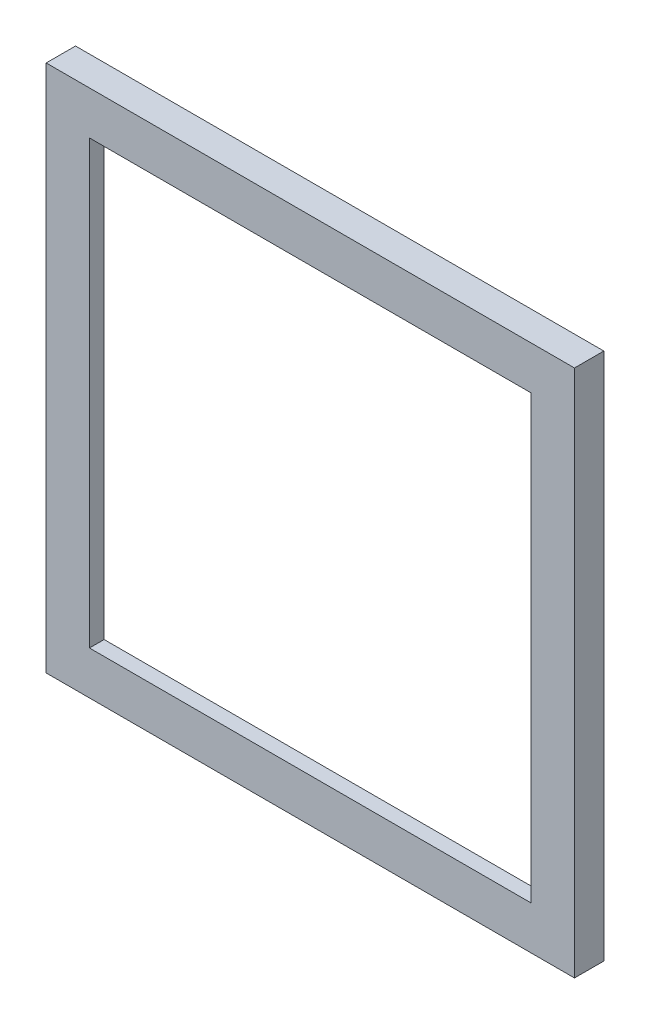
ISO-10303-21;
HEADER;
FILE_DESCRIPTION(('STEP AP214'),'2;1');
FILE_NAME('part.step','',(''),(''),'','','');
FILE_SCHEMA(('AUTOMOTIVE_DESIGN { 1 0 10303 214 1 1 1 1 }'));
ENDSEC;
DATA;
#1=APPLICATION_CONTEXT('core data for automotive mechanical design processes');
#2=APPLICATION_PROTOCOL_DEFINITION('international standard','automotive_design',2000,#1);
#3=PRODUCT_CONTEXT('',#1,'mechanical');
#4=PRODUCT('Part','Part','',(#3));
#5=PRODUCT_RELATED_PRODUCT_CATEGORY('part','',(#4));
#6=PRODUCT_DEFINITION_FORMATION('','',#4);
#7=PRODUCT_DEFINITION_CONTEXT('part definition',#1,'design');
#8=PRODUCT_DEFINITION('design','',#6,#7);
#9=PRODUCT_DEFINITION_SHAPE('','',#8);
#10=(LENGTH_UNIT() NAMED_UNIT(*) SI_UNIT(.MILLI.,.METRE.));
#11=(NAMED_UNIT(*) PLANE_ANGLE_UNIT() SI_UNIT($,.RADIAN.));
#12=(NAMED_UNIT(*) SI_UNIT($,.STERADIAN.) SOLID_ANGLE_UNIT());
#13=UNCERTAINTY_MEASURE_WITH_UNIT(LENGTH_MEASURE(1.E-05),#10,'distance_accuracy_value','');
#14=(GEOMETRIC_REPRESENTATION_CONTEXT(3) GLOBAL_UNCERTAINTY_ASSIGNED_CONTEXT((#13)) GLOBAL_UNIT_ASSIGNED_CONTEXT((#10,
#11,#12)) REPRESENTATION_CONTEXT('',''));
#15=CARTESIAN_POINT('',(0.,0.,0.));
#16=DIRECTION('',(0.,0.,1.));
#17=DIRECTION('',(1.,0.,0.));
#18=AXIS2_PLACEMENT_3D('',#15,#16,#17);
#19=CARTESIAN_POINT('',(0.,0.,2.));
#20=DIRECTION('',(0.,0.,-1.));
#21=DIRECTION('',(-1.,0.,0.));
#22=AXIS2_PLACEMENT_3D('',#19,#20,#21);
#23=PLANE('',#22);
#24=DIRECTION('',(0.,1.,0.));
#25=VECTOR('',#24,1.);
#26=CARTESIAN_POINT('',(18.,-18.,2.));
#27=LINE('',#26,#25);
#28=CARTESIAN_POINT('',(18.,-18.,2.));
#29=VERTEX_POINT('',#28);
#30=CARTESIAN_POINT('',(18.,18.,2.));
#31=VERTEX_POINT('',#30);
#32=EDGE_CURVE('E190',#29,#31,#27,.T.);
#33=ORIENTED_EDGE('',*,*,#32,.T.);
#34=DIRECTION('',(-1.,0.,0.));
#35=VECTOR('',#34,1.);
#36=CARTESIAN_POINT('',(-18.,18.,2.));
#37=LINE('',#36,#35);
#38=CARTESIAN_POINT('',(-18.,18.,2.));
#39=VERTEX_POINT('',#38);
#40=EDGE_CURVE('E193',#31,#39,#37,.T.);
#41=ORIENTED_EDGE('',*,*,#40,.T.);
#42=DIRECTION('',(0.,-1.,0.));
#43=VECTOR('',#42,1.);
#44=CARTESIAN_POINT('',(-18.,-18.,2.));
#45=LINE('',#44,#43);
#46=CARTESIAN_POINT('',(-18.,-18.,2.));
#47=VERTEX_POINT('',#46);
#48=EDGE_CURVE('E196',#39,#47,#45,.T.);
#49=ORIENTED_EDGE('',*,*,#48,.T.);
#50=DIRECTION('',(1.,0.,0.));
#51=VECTOR('',#50,1.);
#52=CARTESIAN_POINT('',(-18.,-18.,2.));
#53=LINE('',#52,#51);
#54=EDGE_CURVE('E198',#47,#29,#53,.T.);
#55=ORIENTED_EDGE('',*,*,#54,.T.);
#56=EDGE_LOOP('',(#33,#41,#49,#55));
#57=FACE_BOUND('',#56,.T.);
#58=DIRECTION('',(0.,1.,0.));
#59=VECTOR('',#58,1.);
#60=CARTESIAN_POINT('',(15.05,-15.05,2.));
#61=LINE('',#60,#59);
#62=CARTESIAN_POINT('',(15.05,-15.05,2.));
#63=VERTEX_POINT('',#62);
#64=CARTESIAN_POINT('',(15.05,15.05,2.));
#65=VERTEX_POINT('',#64);
#66=EDGE_CURVE('E168',#63,#65,#61,.T.);
#67=ORIENTED_EDGE('',*,*,#66,.F.);
#68=DIRECTION('',(1.,0.,0.));
#69=VECTOR('',#68,1.);
#70=CARTESIAN_POINT('',(-15.05,-15.05,2.));
#71=LINE('',#70,#69);
#72=CARTESIAN_POINT('',(-15.05,-15.05,2.));
#73=VERTEX_POINT('',#72);
#74=EDGE_CURVE('E175',#73,#63,#71,.T.);
#75=ORIENTED_EDGE('',*,*,#74,.F.);
#76=DIRECTION('',(0.,-1.,0.));
#77=VECTOR('',#76,1.);
#78=CARTESIAN_POINT('',(-15.05,-15.05,2.));
#79=LINE('',#78,#77);
#80=CARTESIAN_POINT('',(-15.05,15.05,2.));
#81=VERTEX_POINT('',#80);
#82=EDGE_CURVE('E172',#81,#73,#79,.T.);
#83=ORIENTED_EDGE('',*,*,#82,.F.);
#84=DIRECTION('',(-1.,0.,0.));
#85=VECTOR('',#84,1.);
#86=CARTESIAN_POINT('',(-15.05,15.05,2.));
#87=LINE('',#86,#85);
#88=EDGE_CURVE('E170',#65,#81,#87,.T.);
#89=ORIENTED_EDGE('',*,*,#88,.F.);
#90=EDGE_LOOP('',(#67,#75,#83,#89));
#91=FACE_BOUND('',#90,.T.);
#92=ADVANCED_FACE('F37',(#57,#91),#23,.F.);
#93=CARTESIAN_POINT('',(0.,0.,0.));
#94=DIRECTION('',(0.,0.,-1.));
#95=DIRECTION('',(-1.,0.,0.));
#96=AXIS2_PLACEMENT_3D('',#93,#94,#95);
#97=PLANE('',#96);
#98=DIRECTION('',(0.,1.,0.));
#99=VECTOR('',#98,1.);
#100=CARTESIAN_POINT('',(-17.,-17.,0.));
#101=LINE('',#100,#99);
#102=CARTESIAN_POINT('',(-17.,-17.,0.));
#103=VERTEX_POINT('',#102);
#104=CARTESIAN_POINT('',(-17.,17.,0.));
#105=VERTEX_POINT('',#104);
#106=EDGE_CURVE('E52',#103,#105,#101,.T.);
#107=ORIENTED_EDGE('',*,*,#106,.F.);
#108=DIRECTION('',(-1.,0.,0.));
#109=VECTOR('',#108,1.);
#110=CARTESIAN_POINT('',(17.,-17.,0.));
#111=LINE('',#110,#109);
#112=CARTESIAN_POINT('',(17.,-17.,0.));
#113=VERTEX_POINT('',#112);
#114=EDGE_CURVE('E145',#113,#103,#111,.T.);
#115=ORIENTED_EDGE('',*,*,#114,.F.);
#116=DIRECTION('',(0.,-1.,0.));
#117=VECTOR('',#116,1.);
#118=CARTESIAN_POINT('',(17.,-17.,0.));
#119=LINE('',#118,#117);
#120=CARTESIAN_POINT('',(17.,17.,0.));
#121=VERTEX_POINT('',#120);
#122=EDGE_CURVE('E148',#121,#113,#119,.T.);
#123=ORIENTED_EDGE('',*,*,#122,.F.);
#124=DIRECTION('',(1.,0.,0.));
#125=VECTOR('',#124,1.);
#126=CARTESIAN_POINT('',(17.,17.,0.));
#127=LINE('',#126,#125);
#128=EDGE_CURVE('E154',#105,#121,#127,.T.);
#129=ORIENTED_EDGE('',*,*,#128,.F.);
#130=EDGE_LOOP('',(#107,#115,#123,#129));
#131=FACE_BOUND('',#130,.T.);
#132=DIRECTION('',(0.,1.,0.));
#133=VECTOR('',#132,1.);
#134=CARTESIAN_POINT('',(18.,-18.,0.));
#135=LINE('',#134,#133);
#136=CARTESIAN_POINT('',(18.,-18.,0.));
#137=VERTEX_POINT('',#136);
#138=CARTESIAN_POINT('',(18.,18.,0.));
#139=VERTEX_POINT('',#138);
#140=EDGE_CURVE('E189',#137,#139,#135,.T.);
#141=ORIENTED_EDGE('',*,*,#140,.F.);
#142=DIRECTION('',(1.,0.,0.));
#143=VECTOR('',#142,1.);
#144=CARTESIAN_POINT('',(-18.,-18.,0.));
#145=LINE('',#144,#143);
#146=CARTESIAN_POINT('',(-18.,-18.,0.));
#147=VERTEX_POINT('',#146);
#148=EDGE_CURVE('E194',#147,#137,#145,.T.);
#149=ORIENTED_EDGE('',*,*,#148,.F.);
#150=DIRECTION('',(0.,-1.,0.));
#151=VECTOR('',#150,1.);
#152=CARTESIAN_POINT('',(-18.,-18.,0.));
#153=LINE('',#152,#151);
#154=CARTESIAN_POINT('',(-18.,18.,0.));
#155=VERTEX_POINT('',#154);
#156=EDGE_CURVE('E205',#155,#147,#153,.T.);
#157=ORIENTED_EDGE('',*,*,#156,.F.);
#158=DIRECTION('',(-1.,0.,0.));
#159=VECTOR('',#158,1.);
#160=CARTESIAN_POINT('',(-18.,18.,0.));
#161=LINE('',#160,#159);
#162=EDGE_CURVE('E203',#139,#155,#161,.T.);
#163=ORIENTED_EDGE('',*,*,#162,.F.);
#164=EDGE_LOOP('',(#141,#149,#157,#163));
#165=FACE_BOUND('',#164,.T.);
#166=ADVANCED_FACE('F226',(#131,#165),#97,.T.);
#167=CARTESIAN_POINT('',(18.,-18.,2.));
#168=DIRECTION('',(-1.,0.,0.));
#169=DIRECTION('',(0.,0.,1.));
#170=AXIS2_PLACEMENT_3D('',#167,#168,#169);
#171=PLANE('',#170);
#172=ORIENTED_EDGE('',*,*,#140,.T.);
#173=DIRECTION('',(0.,0.,-1.));
#174=VECTOR('',#173,1.);
#175=CARTESIAN_POINT('',(18.,18.,2.));
#176=LINE('',#175,#174);
#177=EDGE_CURVE('E45',#31,#139,#176,.T.);
#178=ORIENTED_EDGE('',*,*,#177,.F.);
#179=ORIENTED_EDGE('',*,*,#32,.F.);
#180=DIRECTION('',(0.,0.,-1.));
#181=VECTOR('',#180,1.);
#182=CARTESIAN_POINT('',(18.,-18.,2.));
#183=LINE('',#182,#181);
#184=EDGE_CURVE('E200',#29,#137,#183,.T.);
#185=ORIENTED_EDGE('',*,*,#184,.T.);
#186=EDGE_LOOP('',(#172,#178,#179,#185));
#187=FACE_BOUND('',#186,.T.);
#188=ADVANCED_FACE('F39',(#187),#171,.F.);
#189=CARTESIAN_POINT('',(-18.,18.,2.));
#190=DIRECTION('',(0.,-1.,0.));
#191=DIRECTION('',(0.,0.,-1.));
#192=AXIS2_PLACEMENT_3D('',#189,#190,#191);
#193=PLANE('',#192);
#194=ORIENTED_EDGE('',*,*,#162,.T.);
#195=DIRECTION('',(0.,0.,-1.));
#196=VECTOR('',#195,1.);
#197=CARTESIAN_POINT('',(-18.,18.,2.));
#198=LINE('',#197,#196);
#199=EDGE_CURVE('E213',#39,#155,#198,.T.);
#200=ORIENTED_EDGE('',*,*,#199,.F.);
#201=ORIENTED_EDGE('',*,*,#40,.F.);
#202=ORIENTED_EDGE('',*,*,#177,.T.);
#203=EDGE_LOOP('',(#194,#200,#201,#202));
#204=FACE_BOUND('',#203,.T.);
#205=ADVANCED_FACE('F218',(#204),#193,.F.);
#206=CARTESIAN_POINT('',(-18.,-18.,2.));
#207=DIRECTION('',(1.,0.,0.));
#208=DIRECTION('',(0.,0.,-1.));
#209=AXIS2_PLACEMENT_3D('',#206,#207,#208);
#210=PLANE('',#209);
#211=ORIENTED_EDGE('',*,*,#156,.T.);
#212=DIRECTION('',(0.,0.,-1.));
#213=VECTOR('',#212,1.);
#214=CARTESIAN_POINT('',(-18.,-18.,2.));
#215=LINE('',#214,#213);
#216=EDGE_CURVE('E210',#47,#147,#215,.T.);
#217=ORIENTED_EDGE('',*,*,#216,.F.);
#218=ORIENTED_EDGE('',*,*,#48,.F.);
#219=ORIENTED_EDGE('',*,*,#199,.T.);
#220=EDGE_LOOP('',(#211,#217,#218,#219));
#221=FACE_BOUND('',#220,.T.);
#222=ADVANCED_FACE('F230',(#221),#210,.F.);
#223=CARTESIAN_POINT('',(-18.,-18.,2.));
#224=DIRECTION('',(0.,1.,0.));
#225=DIRECTION('',(0.,0.,1.));
#226=AXIS2_PLACEMENT_3D('',#223,#224,#225);
#227=PLANE('',#226);
#228=ORIENTED_EDGE('',*,*,#148,.T.);
#229=ORIENTED_EDGE('',*,*,#184,.F.);
#230=ORIENTED_EDGE('',*,*,#54,.F.);
#231=ORIENTED_EDGE('',*,*,#216,.T.);
#232=EDGE_LOOP('',(#228,#229,#230,#231));
#233=FACE_BOUND('',#232,.T.);
#234=ADVANCED_FACE('F234',(#233),#227,.F.);
#235=CARTESIAN_POINT('',(15.05,-15.05,2.));
#236=DIRECTION('',(-1.,0.,0.));
#237=DIRECTION('',(0.,0.,1.));
#238=AXIS2_PLACEMENT_3D('',#235,#236,#237);
#239=PLANE('',#238);
#240=DIRECTION('',(0.,1.,0.));
#241=VECTOR('',#240,1.);
#242=CARTESIAN_POINT('',(15.05,-15.05,1.));
#243=LINE('',#242,#241);
#244=CARTESIAN_POINT('',(15.05,-15.05,1.));
#245=VERTEX_POINT('',#244);
#246=CARTESIAN_POINT('',(15.05,15.05,1.));
#247=VERTEX_POINT('',#246);
#248=EDGE_CURVE('E166',#245,#247,#243,.T.);
#249=ORIENTED_EDGE('',*,*,#248,.F.);
#250=DIRECTION('',(0.,0.,-1.));
#251=VECTOR('',#250,1.);
#252=CARTESIAN_POINT('',(15.05,-15.05,2.));
#253=LINE('',#252,#251);
#254=EDGE_CURVE('E177',#63,#245,#253,.T.);
#255=ORIENTED_EDGE('',*,*,#254,.F.);
#256=ORIENTED_EDGE('',*,*,#66,.T.);
#257=DIRECTION('',(0.,0.,-1.));
#258=VECTOR('',#257,1.);
#259=CARTESIAN_POINT('',(15.05,15.05,2.));
#260=LINE('',#259,#258);
#261=EDGE_CURVE('E186',#65,#247,#260,.T.);
#262=ORIENTED_EDGE('',*,*,#261,.T.);
#263=EDGE_LOOP('',(#249,#255,#256,#262));
#264=FACE_BOUND('',#263,.T.);
#265=ADVANCED_FACE('F247',(#264),#239,.T.);
#266=CARTESIAN_POINT('',(-15.05,15.05,2.));
#267=DIRECTION('',(0.,-1.,0.));
#268=DIRECTION('',(0.,0.,-1.));
#269=AXIS2_PLACEMENT_3D('',#266,#267,#268);
#270=PLANE('',#269);
#271=DIRECTION('',(-1.,0.,0.));
#272=VECTOR('',#271,1.);
#273=CARTESIAN_POINT('',(-15.05,15.05,1.));
#274=LINE('',#273,#272);
#275=CARTESIAN_POINT('',(-15.05,15.05,1.));
#276=VERTEX_POINT('',#275);
#277=EDGE_CURVE('E164',#247,#276,#274,.T.);
#278=ORIENTED_EDGE('',*,*,#277,.F.);
#279=ORIENTED_EDGE('',*,*,#261,.F.);
#280=ORIENTED_EDGE('',*,*,#88,.T.);
#281=DIRECTION('',(0.,0.,-1.));
#282=VECTOR('',#281,1.);
#283=CARTESIAN_POINT('',(-15.05,15.05,2.));
#284=LINE('',#283,#282);
#285=EDGE_CURVE('E183',#81,#276,#284,.T.);
#286=ORIENTED_EDGE('',*,*,#285,.T.);
#287=EDGE_LOOP('',(#278,#279,#280,#286));
#288=FACE_BOUND('',#287,.T.);
#289=ADVANCED_FACE('F250',(#288),#270,.T.);
#290=CARTESIAN_POINT('',(-15.05,-15.05,2.));
#291=DIRECTION('',(1.,0.,0.));
#292=DIRECTION('',(0.,0.,-1.));
#293=AXIS2_PLACEMENT_3D('',#290,#291,#292);
#294=PLANE('',#293);
#295=DIRECTION('',(0.,-1.,0.));
#296=VECTOR('',#295,1.);
#297=CARTESIAN_POINT('',(-15.05,-15.05,1.));
#298=LINE('',#297,#296);
#299=CARTESIAN_POINT('',(-15.05,-15.05,1.));
#300=VERTEX_POINT('',#299);
#301=EDGE_CURVE('E59',#276,#300,#298,.T.);
#302=ORIENTED_EDGE('',*,*,#301,.F.);
#303=ORIENTED_EDGE('',*,*,#285,.F.);
#304=ORIENTED_EDGE('',*,*,#82,.T.);
#305=DIRECTION('',(0.,0.,-1.));
#306=VECTOR('',#305,1.);
#307=CARTESIAN_POINT('',(-15.05,-15.05,2.));
#308=LINE('',#307,#306);
#309=EDGE_CURVE('E180',#73,#300,#308,.T.);
#310=ORIENTED_EDGE('',*,*,#309,.T.);
#311=EDGE_LOOP('',(#302,#303,#304,#310));
#312=FACE_BOUND('',#311,.T.);
#313=ADVANCED_FACE('F253',(#312),#294,.T.);
#314=CARTESIAN_POINT('',(-15.05,-15.05,2.));
#315=DIRECTION('',(0.,1.,0.));
#316=DIRECTION('',(0.,0.,1.));
#317=AXIS2_PLACEMENT_3D('',#314,#315,#316);
#318=PLANE('',#317);
#319=DIRECTION('',(1.,0.,0.));
#320=VECTOR('',#319,1.);
#321=CARTESIAN_POINT('',(-15.05,-15.05,1.));
#322=LINE('',#321,#320);
#323=EDGE_CURVE('E11',#300,#245,#322,.T.);
#324=ORIENTED_EDGE('',*,*,#323,.F.);
#325=ORIENTED_EDGE('',*,*,#309,.F.);
#326=ORIENTED_EDGE('',*,*,#74,.T.);
#327=ORIENTED_EDGE('',*,*,#254,.T.);
#328=EDGE_LOOP('',(#324,#325,#326,#327));
#329=FACE_BOUND('',#328,.T.);
#330=ADVANCED_FACE('F255',(#329),#318,.T.);
#331=CARTESIAN_POINT('',(-17.,-17.,1.));
#332=DIRECTION('',(-1.,0.,0.));
#333=DIRECTION('',(0.,0.,1.));
#334=AXIS2_PLACEMENT_3D('',#331,#332,#333);
#335=PLANE('',#334);
#336=ORIENTED_EDGE('',*,*,#106,.T.);
#337=DIRECTION('',(0.,0.,-1.));
#338=VECTOR('',#337,1.);
#339=CARTESIAN_POINT('',(-17.,17.,1.));
#340=LINE('',#339,#338);
#341=CARTESIAN_POINT('',(-17.,17.,1.));
#342=VERTEX_POINT('',#341);
#343=EDGE_CURVE('E123',#342,#105,#340,.T.);
#344=ORIENTED_EDGE('',*,*,#343,.F.);
#345=DIRECTION('',(0.,1.,0.));
#346=VECTOR('',#345,1.);
#347=CARTESIAN_POINT('',(-17.,-17.,1.));
#348=LINE('',#347,#346);
#349=CARTESIAN_POINT('',(-17.,-17.,1.));
#350=VERTEX_POINT('',#349);
#351=EDGE_CURVE('E127',#350,#342,#348,.T.);
#352=ORIENTED_EDGE('',*,*,#351,.F.);
#353=DIRECTION('',(0.,0.,-1.));
#354=VECTOR('',#353,1.);
#355=CARTESIAN_POINT('',(-17.,-17.,1.));
#356=LINE('',#355,#354);
#357=EDGE_CURVE('E158',#350,#103,#356,.T.);
#358=ORIENTED_EDGE('',*,*,#357,.T.);
#359=EDGE_LOOP('',(#336,#344,#352,#358));
#360=FACE_BOUND('',#359,.T.);
#361=ADVANCED_FACE('F125',(#360),#335,.F.);
#362=CARTESIAN_POINT('',(17.,-17.,1.));
#363=DIRECTION('',(0.,-1.,0.));
#364=DIRECTION('',(0.,0.,-1.));
#365=AXIS2_PLACEMENT_3D('',#362,#363,#364);
#366=PLANE('',#365);
#367=ORIENTED_EDGE('',*,*,#114,.T.);
#368=ORIENTED_EDGE('',*,*,#357,.F.);
#369=DIRECTION('',(-1.,0.,0.));
#370=VECTOR('',#369,1.);
#371=CARTESIAN_POINT('',(17.,-17.,1.));
#372=LINE('',#371,#370);
#373=CARTESIAN_POINT('',(17.,-17.,1.));
#374=VERTEX_POINT('',#373);
#375=EDGE_CURVE('E133',#374,#350,#372,.T.);
#376=ORIENTED_EDGE('',*,*,#375,.F.);
#377=DIRECTION('',(0.,0.,-1.));
#378=VECTOR('',#377,1.);
#379=CARTESIAN_POINT('',(17.,-17.,1.));
#380=LINE('',#379,#378);
#381=EDGE_CURVE('E160',#374,#113,#380,.T.);
#382=ORIENTED_EDGE('',*,*,#381,.T.);
#383=EDGE_LOOP('',(#367,#368,#376,#382));
#384=FACE_BOUND('',#383,.T.);
#385=ADVANCED_FACE('F262',(#384),#366,.F.);
#386=CARTESIAN_POINT('',(17.,-17.,1.));
#387=DIRECTION('',(1.,0.,0.));
#388=DIRECTION('',(0.,0.,-1.));
#389=AXIS2_PLACEMENT_3D('',#386,#387,#388);
#390=PLANE('',#389);
#391=ORIENTED_EDGE('',*,*,#122,.T.);
#392=ORIENTED_EDGE('',*,*,#381,.F.);
#393=DIRECTION('',(0.,-1.,0.));
#394=VECTOR('',#393,1.);
#395=CARTESIAN_POINT('',(17.,-17.,1.));
#396=LINE('',#395,#394);
#397=CARTESIAN_POINT('',(17.,17.,1.));
#398=VERTEX_POINT('',#397);
#399=EDGE_CURVE('E141',#398,#374,#396,.T.);
#400=ORIENTED_EDGE('',*,*,#399,.F.);
#401=DIRECTION('',(0.,0.,-1.));
#402=VECTOR('',#401,1.);
#403=CARTESIAN_POINT('',(17.,17.,1.));
#404=LINE('',#403,#402);
#405=EDGE_CURVE('E132',#398,#121,#404,.T.);
#406=ORIENTED_EDGE('',*,*,#405,.T.);
#407=EDGE_LOOP('',(#391,#392,#400,#406));
#408=FACE_BOUND('',#407,.T.);
#409=ADVANCED_FACE('F366',(#408),#390,.F.);
#410=CARTESIAN_POINT('',(17.,17.,1.));
#411=DIRECTION('',(0.,1.,0.));
#412=DIRECTION('',(0.,0.,1.));
#413=AXIS2_PLACEMENT_3D('',#410,#411,#412);
#414=PLANE('',#413);
#415=ORIENTED_EDGE('',*,*,#128,.T.);
#416=ORIENTED_EDGE('',*,*,#405,.F.);
#417=DIRECTION('',(1.,0.,0.));
#418=VECTOR('',#417,1.);
#419=CARTESIAN_POINT('',(17.,17.,1.));
#420=LINE('',#419,#418);
#421=EDGE_CURVE('E136',#342,#398,#420,.T.);
#422=ORIENTED_EDGE('',*,*,#421,.F.);
#423=ORIENTED_EDGE('',*,*,#343,.T.);
#424=EDGE_LOOP('',(#415,#416,#422,#423));
#425=FACE_BOUND('',#424,.T.);
#426=ADVANCED_FACE('F137',(#425),#414,.F.);
#427=CARTESIAN_POINT('',(0.,0.,1.));
#428=DIRECTION('',(0.,0.,1.));
#429=DIRECTION('',(1.,0.,0.));
#430=AXIS2_PLACEMENT_3D('',#427,#428,#429);
#431=PLANE('',#430);
#432=ORIENTED_EDGE('',*,*,#248,.T.);
#433=ORIENTED_EDGE('',*,*,#277,.T.);
#434=ORIENTED_EDGE('',*,*,#301,.T.);
#435=ORIENTED_EDGE('',*,*,#323,.T.);
#436=EDGE_LOOP('',(#432,#433,#434,#435));
#437=FACE_BOUND('',#436,.T.);
#438=ORIENTED_EDGE('',*,*,#351,.T.);
#439=ORIENTED_EDGE('',*,*,#421,.T.);
#440=ORIENTED_EDGE('',*,*,#399,.T.);
#441=ORIENTED_EDGE('',*,*,#375,.T.);
#442=EDGE_LOOP('',(#438,#439,#440,#441));
#443=FACE_BOUND('',#442,.T.);
#444=ADVANCED_FACE('F143',(#437,#443),#431,.F.);
#445=CLOSED_SHELL('',(#92,#166,#188,#205,#222,#234,#265,#289,#313,#330,#361,#385,#409,#426,#444));
#446=MANIFOLD_SOLID_BREP('B2',#445);
#447=ADVANCED_BREP_SHAPE_REPRESENTATION('',(#18,#446),#14);
#448=SHAPE_DEFINITION_REPRESENTATION(#9,#447);
ENDSEC;
END-ISO-10303-21;
